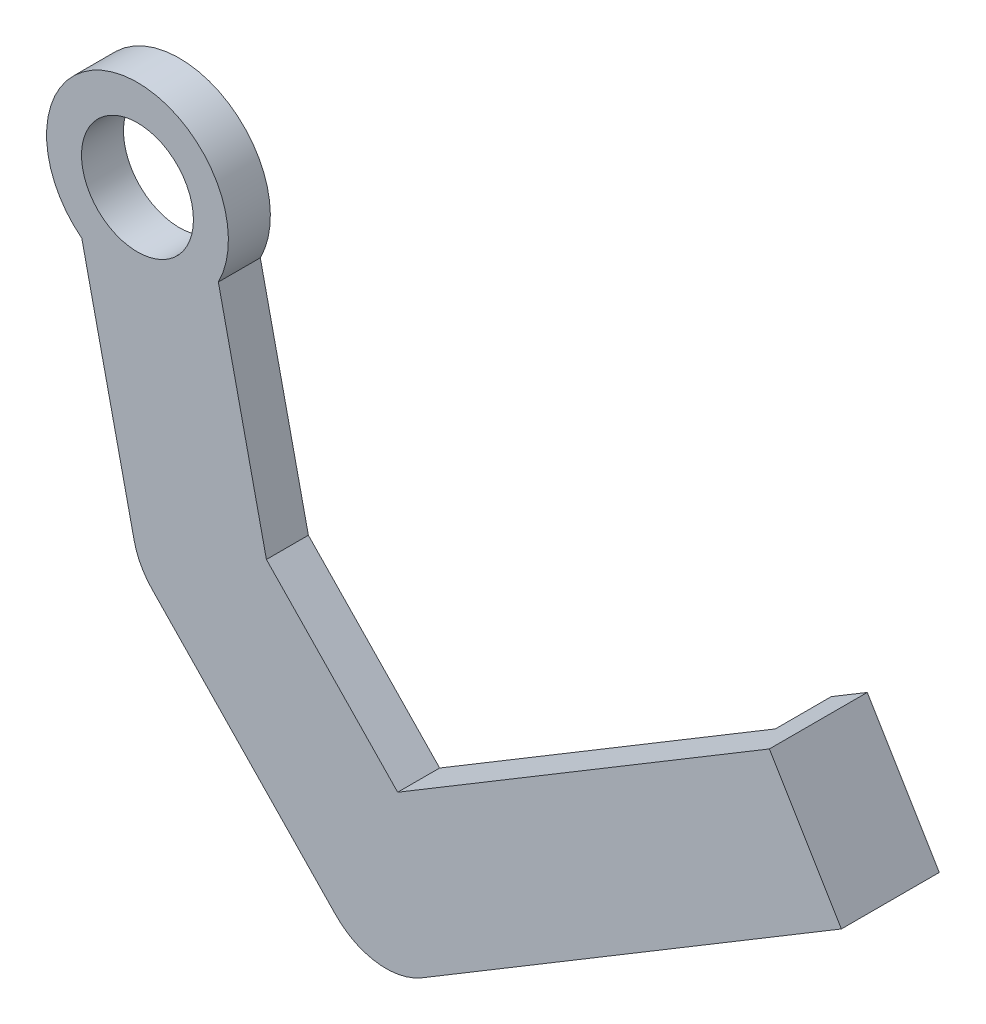
ISO-10303-21;
HEADER;
FILE_DESCRIPTION(('STEP AP214'),'2;1');
FILE_NAME('part.step','',(''),(''),'','','');
FILE_SCHEMA(('AUTOMOTIVE_DESIGN { 1 0 10303 214 1 1 1 1 }'));
ENDSEC;
DATA;
#1=APPLICATION_CONTEXT('core data for automotive mechanical design processes');
#2=APPLICATION_PROTOCOL_DEFINITION('international standard','automotive_design',2000,#1);
#3=PRODUCT_CONTEXT('',#1,'mechanical');
#4=PRODUCT('Part','Part','',(#3));
#5=PRODUCT_RELATED_PRODUCT_CATEGORY('part','',(#4));
#6=PRODUCT_DEFINITION_FORMATION('','',#4);
#7=PRODUCT_DEFINITION_CONTEXT('part definition',#1,'design');
#8=PRODUCT_DEFINITION('design','',#6,#7);
#9=PRODUCT_DEFINITION_SHAPE('','',#8);
#10=(LENGTH_UNIT() NAMED_UNIT(*) SI_UNIT(.MILLI.,.METRE.));
#11=(NAMED_UNIT(*) PLANE_ANGLE_UNIT() SI_UNIT($,.RADIAN.));
#12=(NAMED_UNIT(*) SI_UNIT($,.STERADIAN.) SOLID_ANGLE_UNIT());
#13=UNCERTAINTY_MEASURE_WITH_UNIT(LENGTH_MEASURE(1.E-05),#10,'distance_accuracy_value','');
#14=(GEOMETRIC_REPRESENTATION_CONTEXT(3) GLOBAL_UNCERTAINTY_ASSIGNED_CONTEXT((#13)) GLOBAL_UNIT_ASSIGNED_CONTEXT((#10,
#11,#12)) REPRESENTATION_CONTEXT('',''));
#15=CARTESIAN_POINT('',(0.,0.,0.));
#16=DIRECTION('',(0.,0.,1.));
#17=DIRECTION('',(1.,0.,0.));
#18=AXIS2_PLACEMENT_3D('',#15,#16,#17);
#19=CARTESIAN_POINT('',(18.232002668122,56.112334461414,56.5));
#20=DIRECTION('',(0.,0.,1.));
#21=DIRECTION('',(1.,0.,0.));
#22=AXIS2_PLACEMENT_3D('',#19,#20,#21);
#23=CYLINDRICAL_SURFACE('',#22,4.);
#24=DIRECTION('',(0.,0.,1.));
#25=VECTOR('',#24,1.);
#26=CARTESIAN_POINT('',(22.232002668122,56.112334461414,56.5));
#27=LINE('',#26,#25);
#28=CARTESIAN_POINT('',(22.232002668122,56.112334461414,57.5));
#29=VERTEX_POINT('',#28);
#30=CARTESIAN_POINT('',(22.232002668122,56.112334461414,60.5));
#31=VERTEX_POINT('',#30);
#32=EDGE_CURVE('E9',#29,#31,#27,.T.);
#33=ORIENTED_EDGE('',*,*,#32,.F.);
#34=CARTESIAN_POINT('',(18.232002668122,56.112334461414,57.5));
#35=DIRECTION('',(0.,0.,1.));
#36=DIRECTION('',(1.,0.,0.));
#37=AXIS2_PLACEMENT_3D('',#34,#35,#36);
#38=CIRCLE('',#37,4.);
#39=EDGE_CURVE('E241',#29,#29,#38,.T.);
#40=ORIENTED_EDGE('',*,*,#39,.F.);
#41=ORIENTED_EDGE('',*,*,#32,.T.);
#42=CARTESIAN_POINT('',(18.232002668122,56.112334461414,60.5));
#43=DIRECTION('',(0.,0.,-1.));
#44=DIRECTION('',(1.,0.,0.));
#45=AXIS2_PLACEMENT_3D('',#42,#43,#44);
#46=CIRCLE('',#45,4.);
#47=EDGE_CURVE('E191',#31,#31,#46,.T.);
#48=ORIENTED_EDGE('',*,*,#47,.F.);
#49=EDGE_LOOP('',(#33,#40,#41,#48));
#50=FACE_BOUND('',#49,.T.);
#51=ADVANCED_FACE('F15',(#50),#23,.F.);
#52=CARTESIAN_POINT('',(17.993954702188,34.139284193477,57.5));
#53=DIRECTION('',(-0.976176953688626,-0.216975932045917,0.));
#54=DIRECTION('',(-0.216975932045917,0.976176953688626,0.));
#55=AXIS2_PLACEMENT_3D('',#52,#53,#54);
#56=PLANE('',#55);
#57=DIRECTION('',(-0.216975932045917,0.976176953688626,0.));
#58=VECTOR('',#57,1.);
#59=CARTESIAN_POINT('',(17.993954702188,34.139284193477,57.5));
#60=LINE('',#59,#58);
#61=CARTESIAN_POINT('',(17.993954702188,34.139284193477,57.5));
#62=VERTEX_POINT('',#61);
#63=CARTESIAN_POINT('',(14.252286627086,50.973087412213,57.5));
#64=VERTEX_POINT('',#63);
#65=EDGE_CURVE('E150',#62,#64,#60,.T.);
#66=ORIENTED_EDGE('',*,*,#65,.F.);
#67=DIRECTION('',(0.,0.,1.));
#68=VECTOR('',#67,1.);
#69=CARTESIAN_POINT('',(17.993954702188,34.139284193477,57.5));
#70=LINE('',#69,#68);
#71=CARTESIAN_POINT('',(17.993954702188,34.139284193477,60.5));
#72=VERTEX_POINT('',#71);
#73=EDGE_CURVE('E25',#62,#72,#70,.T.);
#74=ORIENTED_EDGE('',*,*,#73,.T.);
#75=DIRECTION('',(-0.216975932045917,0.976176953688626,0.));
#76=VECTOR('',#75,1.);
#77=CARTESIAN_POINT('',(17.993954702188,34.139284193477,60.5));
#78=LINE('',#77,#76);
#79=CARTESIAN_POINT('',(14.252286627086,50.973087412213,60.5));
#80=VERTEX_POINT('',#79);
#81=EDGE_CURVE('E172',#72,#80,#78,.T.);
#82=ORIENTED_EDGE('',*,*,#81,.T.);
#83=DIRECTION('',(0.,0.,1.));
#84=VECTOR('',#83,1.);
#85=CARTESIAN_POINT('',(14.252286627086,50.973087412213,57.5));
#86=LINE('',#85,#84);
#87=EDGE_CURVE('E156',#64,#80,#86,.T.);
#88=ORIENTED_EDGE('',*,*,#87,.F.);
#89=EDGE_LOOP('',(#66,#74,#82,#88));
#90=FACE_BOUND('',#89,.T.);
#91=ADVANCED_FACE('F174',(#90),#56,.T.);
#92=CARTESIAN_POINT('',(22.874839470631,35.224163853708,57.5));
#93=DIRECTION('',(0.,0.,1.));
#94=DIRECTION('',(1.,0.,0.));
#95=AXIS2_PLACEMENT_3D('',#92,#93,#94);
#96=CYLINDRICAL_SURFACE('',#95,5.);
#97=DIRECTION('',(0.,0.,1.));
#98=VECTOR('',#97,1.);
#99=CARTESIAN_POINT('',(19.278140468938,31.750872001413,57.5));
#100=LINE('',#99,#98);
#101=CARTESIAN_POINT('',(19.278140468938,31.750872001413,57.5));
#102=VERTEX_POINT('',#101);
#103=CARTESIAN_POINT('',(19.278140468938,31.750872001413,60.5));
#104=VERTEX_POINT('',#103);
#105=EDGE_CURVE('E162',#102,#104,#100,.T.);
#106=ORIENTED_EDGE('',*,*,#105,.T.);
#107=CARTESIAN_POINT('',(22.874839470631,35.224163853708,60.5));
#108=DIRECTION('',(0.,0.,1.));
#109=DIRECTION('',(1.,0.,0.));
#110=AXIS2_PLACEMENT_3D('',#107,#108,#109);
#111=CIRCLE('',#110,5.);
#112=EDGE_CURVE('E180',#72,#104,#111,.T.);
#113=ORIENTED_EDGE('',*,*,#112,.F.);
#114=ORIENTED_EDGE('',*,*,#73,.F.);
#115=CARTESIAN_POINT('',(22.874839470631,35.224163853708,57.5));
#116=DIRECTION('',(0.,0.,1.));
#117=DIRECTION('',(1.,0.,0.));
#118=AXIS2_PLACEMENT_3D('',#115,#116,#117);
#119=CIRCLE('',#118,5.);
#120=EDGE_CURVE('E153',#62,#102,#119,.T.);
#121=ORIENTED_EDGE('',*,*,#120,.T.);
#122=EDGE_LOOP('',(#106,#113,#114,#121));
#123=FACE_BOUND('',#122,.T.);
#124=ADVANCED_FACE('F17',(#123),#96,.T.);
#125=CARTESIAN_POINT('',(18.232002668122,56.112334461414,57.5));
#126=DIRECTION('',(0.,0.,1.));
#127=DIRECTION('',(1.,0.,0.));
#128=AXIS2_PLACEMENT_3D('',#125,#126,#127);
#129=CYLINDRICAL_SURFACE('',#128,6.5);
#130=CARTESIAN_POINT('',(18.232002668122,56.112334461414,57.5));
#131=DIRECTION('',(0.,0.,-1.));
#132=DIRECTION('',(-0.612264006312972,-0.790653392184963,0.));
#133=AXIS2_PLACEMENT_3D('',#130,#131,#132);
#134=CIRCLE('',#133,6.5);
#135=CARTESIAN_POINT('',(24.014056163972,53.142846732675,57.5));
#136=VERTEX_POINT('',#135);
#137=EDGE_CURVE('E124',#64,#136,#134,.T.);
#138=ORIENTED_EDGE('',*,*,#137,.F.);
#139=ORIENTED_EDGE('',*,*,#87,.T.);
#140=CARTESIAN_POINT('',(18.232002668122,56.112334461414,60.5));
#141=DIRECTION('',(0.,0.,1.));
#142=DIRECTION('',(0.889546691669092,-0.456844265960047,0.));
#143=AXIS2_PLACEMENT_3D('',#140,#141,#142);
#144=CIRCLE('',#143,6.5);
#145=CARTESIAN_POINT('',(24.014056163972,53.142846732675,60.5));
#146=VERTEX_POINT('',#145);
#147=EDGE_CURVE('E130',#146,#80,#144,.T.);
#148=ORIENTED_EDGE('',*,*,#147,.F.);
#149=DIRECTION('',(0.,0.,1.));
#150=VECTOR('',#149,1.);
#151=CARTESIAN_POINT('',(24.014056163972,53.142846732675,57.5));
#152=LINE('',#151,#150);
#153=EDGE_CURVE('E118',#136,#146,#152,.T.);
#154=ORIENTED_EDGE('',*,*,#153,.F.);
#155=EDGE_LOOP('',(#138,#139,#148,#154));
#156=FACE_BOUND('',#155,.T.);
#157=ADVANCED_FACE('F122',(#156),#129,.T.);
#158=CARTESIAN_POINT('',(32.404327627795,18.158307293927,57.5));
#159=DIRECTION('',(-0.719339800338818,-0.694658370458825,0.));
#160=DIRECTION('',(-0.694658370458825,0.719339800338818,0.));
#161=AXIS2_PLACEMENT_3D('',#158,#159,#160);
#162=PLANE('',#161);
#163=DIRECTION('',(-0.694658370458825,0.719339800338818,0.));
#164=VECTOR('',#163,1.);
#165=CARTESIAN_POINT('',(32.404327627795,18.158307293927,57.5));
#166=LINE('',#165,#164);
#167=CARTESIAN_POINT('',(32.404327627795,18.158307293927,57.5));
#168=VERTEX_POINT('',#167);
#169=EDGE_CURVE('E231',#168,#102,#166,.T.);
#170=ORIENTED_EDGE('',*,*,#169,.F.);
#171=DIRECTION('',(0.,0.,1.));
#172=VECTOR('',#171,1.);
#173=CARTESIAN_POINT('',(32.404327627795,18.158307293927,57.5));
#174=LINE('',#173,#172);
#175=CARTESIAN_POINT('',(32.404327627795,18.158307293927,60.5));
#176=VERTEX_POINT('',#175);
#177=EDGE_CURVE('E131',#168,#176,#174,.T.);
#178=ORIENTED_EDGE('',*,*,#177,.T.);
#179=DIRECTION('',(-0.694658370458825,0.719339800338818,0.));
#180=VECTOR('',#179,1.);
#181=CARTESIAN_POINT('',(32.404327627795,18.158307293927,60.5));
#182=LINE('',#181,#180);
#183=EDGE_CURVE('E200',#176,#104,#182,.T.);
#184=ORIENTED_EDGE('',*,*,#183,.T.);
#185=ORIENTED_EDGE('',*,*,#105,.F.);
#186=EDGE_LOOP('',(#170,#178,#184,#185));
#187=FACE_BOUND('',#186,.T.);
#188=ADVANCED_FACE('F329',(#187),#162,.T.);
#189=CARTESIAN_POINT('',(36.001026629489,21.631599146222,57.5));
#190=DIRECTION('',(0.,0.,1.));
#191=DIRECTION('',(1.,0.,0.));
#192=AXIS2_PLACEMENT_3D('',#189,#190,#191);
#193=CYLINDRICAL_SURFACE('',#192,5.);
#194=DIRECTION('',(0.,0.,1.));
#195=VECTOR('',#194,1.);
#196=CARTESIAN_POINT('',(38.576217004039,17.345762642712,57.5));
#197=LINE('',#196,#195);
#198=CARTESIAN_POINT('',(38.576217004039,17.345762642712,57.5));
#199=VERTEX_POINT('',#198);
#200=CARTESIAN_POINT('',(38.576217004039,17.345762642712,60.5));
#201=VERTEX_POINT('',#200);
#202=EDGE_CURVE('E135',#199,#201,#197,.T.);
#203=ORIENTED_EDGE('',*,*,#202,.T.);
#204=CARTESIAN_POINT('',(36.001026629489,21.631599146222,60.5));
#205=DIRECTION('',(0.,0.,1.));
#206=DIRECTION('',(1.,0.,0.));
#207=AXIS2_PLACEMENT_3D('',#204,#205,#206);
#208=CIRCLE('',#207,5.);
#209=EDGE_CURVE('E204',#176,#201,#208,.T.);
#210=ORIENTED_EDGE('',*,*,#209,.F.);
#211=ORIENTED_EDGE('',*,*,#177,.F.);
#212=CARTESIAN_POINT('',(36.001026629489,21.631599146222,57.5));
#213=DIRECTION('',(0.,0.,1.));
#214=DIRECTION('',(1.,0.,0.));
#215=AXIS2_PLACEMENT_3D('',#212,#213,#214);
#216=CIRCLE('',#215,5.);
#217=EDGE_CURVE('E228',#168,#199,#216,.T.);
#218=ORIENTED_EDGE('',*,*,#217,.T.);
#219=EDGE_LOOP('',(#203,#210,#211,#218));
#220=FACE_BOUND('',#219,.T.);
#221=ADVANCED_FACE('F326',(#220),#193,.T.);
#222=CARTESIAN_POINT('',(27.755724239074,36.309043513939,57.5));
#223=DIRECTION('',(-0.976176953688626,-0.216975932045917,0.));
#224=DIRECTION('',(-0.216975932045917,0.976176953688626,0.));
#225=AXIS2_PLACEMENT_3D('',#222,#223,#224);
#226=PLANE('',#225);
#227=ORIENTED_EDGE('',*,*,#153,.T.);
#228=DIRECTION('',(-0.216975932045917,0.976176953688626,0.));
#229=VECTOR('',#228,1.);
#230=CARTESIAN_POINT('',(27.755724239074,36.309043513939,60.5));
#231=LINE('',#230,#229);
#232=CARTESIAN_POINT('',(27.450078210951,37.684148143406,60.5));
#233=VERTEX_POINT('',#232);
#234=EDGE_CURVE('E181',#233,#146,#231,.T.);
#235=ORIENTED_EDGE('',*,*,#234,.F.);
#236=DIRECTION('',(0.,0.,-1.));
#237=VECTOR('',#236,1.);
#238=CARTESIAN_POINT('',(27.450078210951,37.684148143406,57.5));
#239=LINE('',#238,#237);
#240=CARTESIAN_POINT('',(27.450078210951,37.684148143406,57.5));
#241=VERTEX_POINT('',#240);
#242=EDGE_CURVE('E140',#233,#241,#239,.T.);
#243=ORIENTED_EDGE('',*,*,#242,.T.);
#244=DIRECTION('',(-0.216975932045917,0.976176953688626,0.));
#245=VECTOR('',#244,1.);
#246=CARTESIAN_POINT('',(27.755724239074,36.309043513939,57.5));
#247=LINE('',#246,#245);
#248=EDGE_CURVE('E134',#241,#136,#247,.T.);
#249=ORIENTED_EDGE('',*,*,#248,.T.);
#250=EDGE_LOOP('',(#227,#235,#243,#249));
#251=FACE_BOUND('',#250,.T.);
#252=ADVANCED_FACE('F136',(#251),#226,.F.);
#253=CARTESIAN_POINT('',(67.270749562343,34.587177238401,57.5));
#254=DIRECTION('',(0.515038074910064,-0.857167300702106,0.));
#255=DIRECTION('',(0.,0.,-1.));
#256=AXIS2_PLACEMENT_3D('',#253,#254,#255);
#257=PLANE('',#256);
#258=DIRECTION('',(0.857167300702106,0.515038074910064,0.));
#259=VECTOR('',#258,1.);
#260=CARTESIAN_POINT('',(38.576217004039,17.345762642712,60.5));
#261=LINE('',#260,#259);
#262=CARTESIAN_POINT('',(68.556500513396,35.359734350766,60.5));
#263=VERTEX_POINT('',#262);
#264=EDGE_CURVE('E199',#201,#263,#261,.T.);
#265=ORIENTED_EDGE('',*,*,#264,.F.);
#266=ORIENTED_EDGE('',*,*,#202,.F.);
#267=DIRECTION('',(-0.857167300702106,-0.515038074910064,0.));
#268=VECTOR('',#267,1.);
#269=CARTESIAN_POINT('',(67.270749562343,34.587177238401,57.5));
#270=LINE('',#269,#268);
#271=CARTESIAN_POINT('',(65.98499861129,33.814620126036,57.5));
#272=VERTEX_POINT('',#271);
#273=EDGE_CURVE('E223',#272,#199,#270,.T.);
#274=ORIENTED_EDGE('',*,*,#273,.F.);
#275=DIRECTION('',(0.,0.,1.));
#276=VECTOR('',#275,1.);
#277=CARTESIAN_POINT('',(65.98499861129,33.814620126036,53.5));
#278=LINE('',#277,#276);
#279=CARTESIAN_POINT('',(65.98499861129,33.814620126036,53.5));
#280=VERTEX_POINT('',#279);
#281=EDGE_CURVE('E221',#280,#272,#278,.T.);
#282=ORIENTED_EDGE('',*,*,#281,.F.);
#283=DIRECTION('',(0.857167300702106,0.515038074910064,0.));
#284=VECTOR('',#283,1.);
#285=CARTESIAN_POINT('',(65.98499861129,33.814620126036,53.5));
#286=LINE('',#285,#284);
#287=CARTESIAN_POINT('',(68.556500513396,35.359734350766,53.5));
#288=VERTEX_POINT('',#287);
#289=EDGE_CURVE('E230',#280,#288,#286,.T.);
#290=ORIENTED_EDGE('',*,*,#289,.T.);
#291=DIRECTION('',(0.,0.,1.));
#292=VECTOR('',#291,1.);
#293=CARTESIAN_POINT('',(68.556500513396,35.359734350766,53.5));
#294=LINE('',#293,#292);
#295=EDGE_CURVE('E194',#288,#263,#294,.T.);
#296=ORIENTED_EDGE('',*,*,#295,.T.);
#297=EDGE_LOOP('',(#265,#266,#274,#282,#290,#296));
#298=FACE_BOUND('',#297,.T.);
#299=ADVANCED_FACE('F323',(#298),#257,.T.);
#300=CARTESIAN_POINT('',(39.597725631182,25.104890998517,57.5));
#301=DIRECTION('',(-0.719339800338818,-0.694658370458825,0.));
#302=DIRECTION('',(-0.694658370458825,0.719339800338818,0.));
#303=AXIS2_PLACEMENT_3D('',#300,#301,#302);
#304=PLANE('',#303);
#305=ORIENTED_EDGE('',*,*,#242,.F.);
#306=DIRECTION('',(-0.694658370458825,0.719339800338818,0.));
#307=VECTOR('',#306,1.);
#308=CARTESIAN_POINT('',(39.597725631182,25.104890998517,60.5));
#309=LINE('',#308,#307);
#310=CARTESIAN_POINT('',(36.834944542797,27.965834565907,60.5));
#311=VERTEX_POINT('',#310);
#312=EDGE_CURVE('E190',#311,#233,#309,.T.);
#313=ORIENTED_EDGE('',*,*,#312,.F.);
#314=DIRECTION('',(0.,0.,-1.));
#315=VECTOR('',#314,1.);
#316=CARTESIAN_POINT('',(36.834944542797,27.965834565907,57.5));
#317=LINE('',#316,#315);
#318=CARTESIAN_POINT('',(36.834944542797,27.965834565907,57.5));
#319=VERTEX_POINT('',#318);
#320=EDGE_CURVE('E258',#311,#319,#317,.T.);
#321=ORIENTED_EDGE('',*,*,#320,.T.);
#322=DIRECTION('',(-0.694658370458825,0.719339800338818,0.));
#323=VECTOR('',#322,1.);
#324=CARTESIAN_POINT('',(39.597725631182,25.104890998517,57.5));
#325=LINE('',#324,#323);
#326=EDGE_CURVE('E143',#319,#241,#325,.T.);
#327=ORIENTED_EDGE('',*,*,#326,.T.);
#328=EDGE_LOOP('',(#305,#313,#321,#327));
#329=FACE_BOUND('',#328,.T.);
#330=ADVANCED_FACE('F333',(#329),#304,.F.);
#331=CARTESIAN_POINT('',(62.120368813242,43.158850245422,57.5));
#332=DIRECTION('',(0.,0.,1.));
#333=DIRECTION('',(1.,0.,0.));
#334=AXIS2_PLACEMENT_3D('',#331,#332,#333);
#335=PLANE('',#334);
#336=ORIENTED_EDGE('',*,*,#39,.T.);
#337=EDGE_LOOP('',(#336));
#338=FACE_BOUND('',#337,.T.);
#339=DIRECTION('',(-0.515038074910064,0.857167300702106,0.));
#340=VECTOR('',#339,1.);
#341=CARTESIAN_POINT('',(63.409808236739,38.100456629546,57.5));
#342=LINE('',#341,#340);
#343=CARTESIAN_POINT('',(60.834617862189,42.386293133057,57.5));
#344=VERTEX_POINT('',#343);
#345=EDGE_CURVE('E220',#272,#344,#342,.T.);
#346=ORIENTED_EDGE('',*,*,#345,.F.);
#347=ORIENTED_EDGE('',*,*,#273,.T.);
#348=ORIENTED_EDGE('',*,*,#217,.F.);
#349=ORIENTED_EDGE('',*,*,#169,.T.);
#350=ORIENTED_EDGE('',*,*,#120,.F.);
#351=ORIENTED_EDGE('',*,*,#65,.T.);
#352=ORIENTED_EDGE('',*,*,#137,.T.);
#353=ORIENTED_EDGE('',*,*,#248,.F.);
#354=ORIENTED_EDGE('',*,*,#326,.F.);
#355=DIRECTION('',(-0.857167300702106,-0.515038074910064,0.));
#356=VECTOR('',#355,1.);
#357=CARTESIAN_POINT('',(62.120368813242,43.158850245422,57.5));
#358=LINE('',#357,#356);
#359=EDGE_CURVE('E266',#344,#319,#358,.T.);
#360=ORIENTED_EDGE('',*,*,#359,.F.);
#361=EDGE_LOOP('',(#346,#347,#348,#349,#350,#351,#352,#353,#354,#360));
#362=FACE_BOUND('',#361,.T.);
#363=ADVANCED_FACE('F145',(#338,#362),#335,.F.);
#364=CARTESIAN_POINT('',(65.98499861129,33.814620126036,53.5));
#365=DIRECTION('',(0.,0.,1.));
#366=DIRECTION('',(1.,0.,0.));
#367=AXIS2_PLACEMENT_3D('',#364,#365,#366);
#368=PLANE('',#367);
#369=DIRECTION('',(0.857167300702106,0.515038074910064,0.));
#370=VECTOR('',#369,1.);
#371=CARTESIAN_POINT('',(60.834617862189,42.386293133057,53.5));
#372=LINE('',#371,#370);
#373=CARTESIAN_POINT('',(60.834617862189,42.386293133057,53.5));
#374=VERTEX_POINT('',#373);
#375=CARTESIAN_POINT('',(63.406119764296,43.931407357787,53.5));
#376=VERTEX_POINT('',#375);
#377=EDGE_CURVE('E276',#374,#376,#372,.T.);
#378=ORIENTED_EDGE('',*,*,#377,.T.);
#379=DIRECTION('',(-0.515038074910064,0.857167300702106,0.));
#380=VECTOR('',#379,1.);
#381=CARTESIAN_POINT('',(68.556500513396,35.359734350766,53.5));
#382=LINE('',#381,#380);
#383=EDGE_CURVE('E213',#288,#376,#382,.T.);
#384=ORIENTED_EDGE('',*,*,#383,.F.);
#385=ORIENTED_EDGE('',*,*,#289,.F.);
#386=DIRECTION('',(-0.515038074910064,0.857167300702106,0.));
#387=VECTOR('',#386,1.);
#388=CARTESIAN_POINT('',(65.98499861129,33.814620126036,53.5));
#389=LINE('',#388,#387);
#390=EDGE_CURVE('E219',#280,#374,#389,.T.);
#391=ORIENTED_EDGE('',*,*,#390,.T.);
#392=EDGE_LOOP('',(#378,#384,#385,#391));
#393=FACE_BOUND('',#392,.T.);
#394=ADVANCED_FACE('F312',(#393),#368,.F.);
#395=CARTESIAN_POINT('',(65.98499861129,33.814620126036,53.5));
#396=DIRECTION('',(0.857167300702106,0.515038074910064,0.));
#397=DIRECTION('',(0.,0.,-1.));
#398=AXIS2_PLACEMENT_3D('',#395,#396,#397);
#399=PLANE('',#398);
#400=ORIENTED_EDGE('',*,*,#345,.T.);
#401=DIRECTION('',(0.,0.,1.));
#402=VECTOR('',#401,1.);
#403=CARTESIAN_POINT('',(60.834617862189,42.386293133057,53.5));
#404=LINE('',#403,#402);
#405=EDGE_CURVE('E269',#374,#344,#404,.T.);
#406=ORIENTED_EDGE('',*,*,#405,.F.);
#407=ORIENTED_EDGE('',*,*,#390,.F.);
#408=ORIENTED_EDGE('',*,*,#281,.T.);
#409=EDGE_LOOP('',(#400,#406,#407,#408));
#410=FACE_BOUND('',#409,.T.);
#411=ADVANCED_FACE('F318',(#410),#399,.F.);
#412=CARTESIAN_POINT('',(68.556500513396,35.359734350766,53.5));
#413=DIRECTION('',(0.857167300702106,0.515038074910064,0.));
#414=DIRECTION('',(0.,0.,-1.));
#415=AXIS2_PLACEMENT_3D('',#412,#413,#414);
#416=PLANE('',#415);
#417=ORIENTED_EDGE('',*,*,#295,.F.);
#418=ORIENTED_EDGE('',*,*,#383,.T.);
#419=DIRECTION('',(0.,0.,1.));
#420=VECTOR('',#419,1.);
#421=CARTESIAN_POINT('',(63.406119764296,43.931407357787,53.5));
#422=LINE('',#421,#420);
#423=CARTESIAN_POINT('',(63.406119764296,43.931407357787,60.5));
#424=VERTEX_POINT('',#423);
#425=EDGE_CURVE('E284',#376,#424,#422,.T.);
#426=ORIENTED_EDGE('',*,*,#425,.T.);
#427=DIRECTION('',(-0.515038074910064,0.857167300702106,0.));
#428=VECTOR('',#427,1.);
#429=CARTESIAN_POINT('',(68.556500513396,35.359734350766,60.5));
#430=LINE('',#429,#428);
#431=EDGE_CURVE('E198',#263,#424,#430,.T.);
#432=ORIENTED_EDGE('',*,*,#431,.F.);
#433=EDGE_LOOP('',(#417,#418,#426,#432));
#434=FACE_BOUND('',#433,.T.);
#435=ADVANCED_FACE('F294',(#434),#416,.T.);
#436=CARTESIAN_POINT('',(62.120368813242,43.158850245422,60.5));
#437=DIRECTION('',(0.,0.,1.));
#438=DIRECTION('',(1.,0.,0.));
#439=AXIS2_PLACEMENT_3D('',#436,#437,#438);
#440=PLANE('',#439);
#441=ORIENTED_EDGE('',*,*,#47,.T.);
#442=EDGE_LOOP('',(#441));
#443=FACE_BOUND('',#442,.T.);
#444=DIRECTION('',(0.857167300702106,0.515038074910064,0.));
#445=VECTOR('',#444,1.);
#446=CARTESIAN_POINT('',(36.834944542797,27.965834565907,60.5));
#447=LINE('',#446,#445);
#448=EDGE_CURVE('E255',#311,#424,#447,.T.);
#449=ORIENTED_EDGE('',*,*,#448,.F.);
#450=ORIENTED_EDGE('',*,*,#312,.T.);
#451=ORIENTED_EDGE('',*,*,#234,.T.);
#452=ORIENTED_EDGE('',*,*,#147,.T.);
#453=ORIENTED_EDGE('',*,*,#81,.F.);
#454=ORIENTED_EDGE('',*,*,#112,.T.);
#455=ORIENTED_EDGE('',*,*,#183,.F.);
#456=ORIENTED_EDGE('',*,*,#209,.T.);
#457=ORIENTED_EDGE('',*,*,#264,.T.);
#458=ORIENTED_EDGE('',*,*,#431,.T.);
#459=EDGE_LOOP('',(#449,#450,#451,#452,#453,#454,#455,#456,#457,#458));
#460=FACE_BOUND('',#459,.T.);
#461=ADVANCED_FACE('F178',(#443,#460),#440,.T.);
#462=CARTESIAN_POINT('',(62.120368813242,43.158850245422,57.5));
#463=DIRECTION('',(0.515038074910064,-0.857167300702106,0.));
#464=DIRECTION('',(0.,0.,-1.));
#465=AXIS2_PLACEMENT_3D('',#462,#463,#464);
#466=PLANE('',#465);
#467=ORIENTED_EDGE('',*,*,#425,.F.);
#468=ORIENTED_EDGE('',*,*,#377,.F.);
#469=ORIENTED_EDGE('',*,*,#405,.T.);
#470=ORIENTED_EDGE('',*,*,#359,.T.);
#471=ORIENTED_EDGE('',*,*,#320,.F.);
#472=ORIENTED_EDGE('',*,*,#448,.T.);
#473=EDGE_LOOP('',(#467,#468,#469,#470,#471,#472));
#474=FACE_BOUND('',#473,.T.);
#475=ADVANCED_FACE('F301',(#474),#466,.F.);
#476=CLOSED_SHELL('',(#51,#91,#124,#157,#188,#221,#252,#299,#330,#363,#394,#411,#435,#461,#475));
#477=MANIFOLD_SOLID_BREP('B1',#476);
#478=ADVANCED_BREP_SHAPE_REPRESENTATION('',(#18,#477),#14);
#479=SHAPE_DEFINITION_REPRESENTATION(#9,#478);
ENDSEC;
END-ISO-10303-21;
